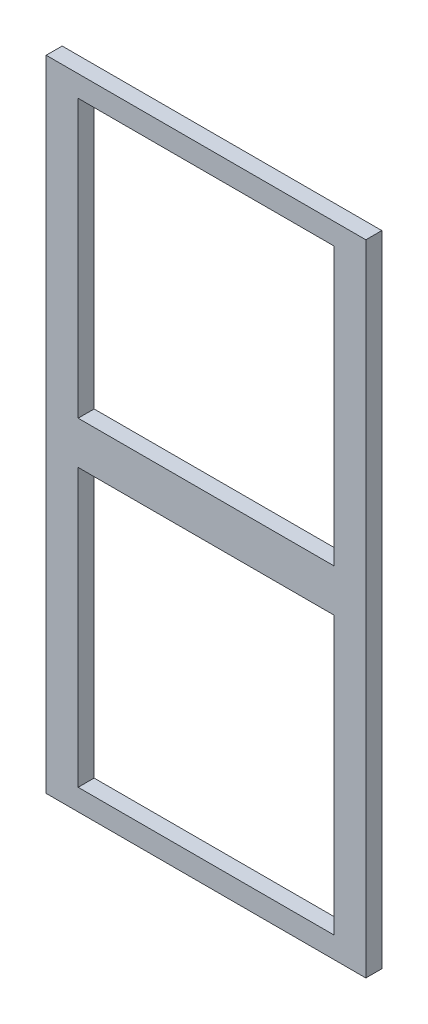
ISO-10303-21;
HEADER;
FILE_DESCRIPTION(('STEP AP214'),'2;1');
FILE_NAME('part.step','',(''),(''),'','','');
FILE_SCHEMA(('AUTOMOTIVE_DESIGN { 1 0 10303 214 1 1 1 1 }'));
ENDSEC;
DATA;
#1=APPLICATION_CONTEXT('core data for automotive mechanical design processes');
#2=APPLICATION_PROTOCOL_DEFINITION('international standard','automotive_design',2000,#1);
#3=PRODUCT_CONTEXT('',#1,'mechanical');
#4=PRODUCT('Part','Part','',(#3));
#5=PRODUCT_RELATED_PRODUCT_CATEGORY('part','',(#4));
#6=PRODUCT_DEFINITION_FORMATION('','',#4);
#7=PRODUCT_DEFINITION_CONTEXT('part definition',#1,'design');
#8=PRODUCT_DEFINITION('design','',#6,#7);
#9=PRODUCT_DEFINITION_SHAPE('','',#8);
#10=(LENGTH_UNIT() NAMED_UNIT(*) SI_UNIT(.MILLI.,.METRE.));
#11=(NAMED_UNIT(*) PLANE_ANGLE_UNIT() SI_UNIT($,.RADIAN.));
#12=(NAMED_UNIT(*) SI_UNIT($,.STERADIAN.) SOLID_ANGLE_UNIT());
#13=UNCERTAINTY_MEASURE_WITH_UNIT(LENGTH_MEASURE(1.E-05),#10,'distance_accuracy_value','');
#14=(GEOMETRIC_REPRESENTATION_CONTEXT(3) GLOBAL_UNCERTAINTY_ASSIGNED_CONTEXT((#13)) GLOBAL_UNIT_ASSIGNED_CONTEXT((#10,
#11,#12)) REPRESENTATION_CONTEXT('',''));
#15=CARTESIAN_POINT('',(0.,0.,0.));
#16=DIRECTION('',(0.,0.,1.));
#17=DIRECTION('',(1.,0.,0.));
#18=AXIS2_PLACEMENT_3D('',#15,#16,#17);
#19=CARTESIAN_POINT('',(7.5,15.,0.75));
#20=DIRECTION('',(-1.,0.,0.));
#21=DIRECTION('',(0.,-1.,0.));
#22=AXIS2_PLACEMENT_3D('',#19,#20,#21);
#23=PLANE('',#22);
#24=DIRECTION('',(0.,1.,0.));
#25=VECTOR('',#24,1.);
#26=CARTESIAN_POINT('',(7.5,15.,0.));
#27=LINE('',#26,#25);
#28=CARTESIAN_POINT('',(7.5,-15.,0.));
#29=VERTEX_POINT('',#28);
#30=CARTESIAN_POINT('',(7.5,15.,0.));
#31=VERTEX_POINT('',#30);
#32=EDGE_CURVE('E185',#29,#31,#27,.T.);
#33=ORIENTED_EDGE('',*,*,#32,.T.);
#34=DIRECTION('',(0.,0.,-1.));
#35=VECTOR('',#34,1.);
#36=CARTESIAN_POINT('',(7.5,15.,0.75));
#37=LINE('',#36,#35);
#38=CARTESIAN_POINT('',(7.5,15.,0.75));
#39=VERTEX_POINT('',#38);
#40=EDGE_CURVE('E11',#39,#31,#37,.T.);
#41=ORIENTED_EDGE('',*,*,#40,.F.);
#42=DIRECTION('',(0.,1.,0.));
#43=VECTOR('',#42,1.);
#44=CARTESIAN_POINT('',(7.5,15.,0.75));
#45=LINE('',#44,#43);
#46=CARTESIAN_POINT('',(7.5,-15.,0.75));
#47=VERTEX_POINT('',#46);
#48=EDGE_CURVE('E192',#47,#39,#45,.T.);
#49=ORIENTED_EDGE('',*,*,#48,.F.);
#50=DIRECTION('',(0.,0.,-1.));
#51=VECTOR('',#50,1.);
#52=CARTESIAN_POINT('',(7.5,-15.,0.75));
#53=LINE('',#52,#51);
#54=EDGE_CURVE('E202',#47,#29,#53,.T.);
#55=ORIENTED_EDGE('',*,*,#54,.T.);
#56=EDGE_LOOP('',(#33,#41,#49,#55));
#57=FACE_BOUND('',#56,.T.);
#58=ADVANCED_FACE('F35',(#57),#23,.F.);
#59=CARTESIAN_POINT('',(-7.5,15.,0.75));
#60=DIRECTION('',(0.,-1.,0.));
#61=DIRECTION('',(0.,0.,-1.));
#62=AXIS2_PLACEMENT_3D('',#59,#60,#61);
#63=PLANE('',#62);
#64=DIRECTION('',(-1.,0.,0.));
#65=VECTOR('',#64,1.);
#66=CARTESIAN_POINT('',(-7.5,15.,0.));
#67=LINE('',#66,#65);
#68=CARTESIAN_POINT('',(-7.5,15.,0.));
#69=VERTEX_POINT('',#68);
#70=EDGE_CURVE('E205',#31,#69,#67,.T.);
#71=ORIENTED_EDGE('',*,*,#70,.T.);
#72=DIRECTION('',(0.,0.,-1.));
#73=VECTOR('',#72,1.);
#74=CARTESIAN_POINT('',(-7.5,15.,0.75));
#75=LINE('',#74,#73);
#76=CARTESIAN_POINT('',(-7.5,15.,0.75));
#77=VERTEX_POINT('',#76);
#78=EDGE_CURVE('E42',#77,#69,#75,.T.);
#79=ORIENTED_EDGE('',*,*,#78,.F.);
#80=DIRECTION('',(-1.,0.,0.));
#81=VECTOR('',#80,1.);
#82=CARTESIAN_POINT('',(-7.5,15.,0.75));
#83=LINE('',#82,#81);
#84=EDGE_CURVE('E195',#39,#77,#83,.T.);
#85=ORIENTED_EDGE('',*,*,#84,.F.);
#86=ORIENTED_EDGE('',*,*,#40,.T.);
#87=EDGE_LOOP('',(#71,#79,#85,#86));
#88=FACE_BOUND('',#87,.T.);
#89=ADVANCED_FACE('F234',(#88),#63,.F.);
#90=CARTESIAN_POINT('',(-7.5,15.,0.75));
#91=DIRECTION('',(1.,0.,0.));
#92=DIRECTION('',(0.,1.,0.));
#93=AXIS2_PLACEMENT_3D('',#90,#91,#92);
#94=PLANE('',#93);
#95=DIRECTION('',(0.,-1.,0.));
#96=VECTOR('',#95,1.);
#97=CARTESIAN_POINT('',(-7.5,15.,0.));
#98=LINE('',#97,#96);
#99=CARTESIAN_POINT('',(-7.5,-15.,0.));
#100=VERTEX_POINT('',#99);
#101=EDGE_CURVE('E207',#69,#100,#98,.T.);
#102=ORIENTED_EDGE('',*,*,#101,.T.);
#103=DIRECTION('',(0.,0.,-1.));
#104=VECTOR('',#103,1.);
#105=CARTESIAN_POINT('',(-7.5,-15.,0.75));
#106=LINE('',#105,#104);
#107=CARTESIAN_POINT('',(-7.5,-15.,0.75));
#108=VERTEX_POINT('',#107);
#109=EDGE_CURVE('E212',#108,#100,#106,.T.);
#110=ORIENTED_EDGE('',*,*,#109,.F.);
#111=DIRECTION('',(0.,-1.,0.));
#112=VECTOR('',#111,1.);
#113=CARTESIAN_POINT('',(-7.5,15.,0.75));
#114=LINE('',#113,#112);
#115=EDGE_CURVE('E198',#77,#108,#114,.T.);
#116=ORIENTED_EDGE('',*,*,#115,.F.);
#117=ORIENTED_EDGE('',*,*,#78,.T.);
#118=EDGE_LOOP('',(#102,#110,#116,#117));
#119=FACE_BOUND('',#118,.T.);
#120=ADVANCED_FACE('F219',(#119),#94,.F.);
#121=CARTESIAN_POINT('',(-7.5,-15.,0.75));
#122=DIRECTION('',(0.,1.,0.));
#123=DIRECTION('',(0.,0.,1.));
#124=AXIS2_PLACEMENT_3D('',#121,#122,#123);
#125=PLANE('',#124);
#126=DIRECTION('',(1.,0.,0.));
#127=VECTOR('',#126,1.);
#128=CARTESIAN_POINT('',(-7.5,-15.,0.));
#129=LINE('',#128,#127);
#130=EDGE_CURVE('E196',#100,#29,#129,.T.);
#131=ORIENTED_EDGE('',*,*,#130,.T.);
#132=ORIENTED_EDGE('',*,*,#54,.F.);
#133=DIRECTION('',(1.,0.,0.));
#134=VECTOR('',#133,1.);
#135=CARTESIAN_POINT('',(-7.5,-15.,0.75));
#136=LINE('',#135,#134);
#137=EDGE_CURVE('E200',#108,#47,#136,.T.);
#138=ORIENTED_EDGE('',*,*,#137,.F.);
#139=ORIENTED_EDGE('',*,*,#109,.T.);
#140=EDGE_LOOP('',(#131,#132,#138,#139));
#141=FACE_BOUND('',#140,.T.);
#142=ADVANCED_FACE('F227',(#141),#125,.F.);
#143=CARTESIAN_POINT('',(0.,0.,0.75));
#144=DIRECTION('',(0.,0.,1.));
#145=DIRECTION('',(1.,0.,0.));
#146=AXIS2_PLACEMENT_3D('',#143,#144,#145);
#147=PLANE('',#146);
#148=DIRECTION('',(0.,-1.,0.));
#149=VECTOR('',#148,1.);
#150=CARTESIAN_POINT('',(-6.,0.999999999999998,0.75));
#151=LINE('',#150,#149);
#152=CARTESIAN_POINT('',(-6.,14.,0.75));
#153=VERTEX_POINT('',#152);
#154=CARTESIAN_POINT('',(-6.,0.999999999999998,0.75));
#155=VERTEX_POINT('',#154);
#156=EDGE_CURVE('E49',#153,#155,#151,.T.);
#157=ORIENTED_EDGE('',*,*,#156,.F.);
#158=DIRECTION('',(-1.,0.,0.));
#159=VECTOR('',#158,1.);
#160=CARTESIAN_POINT('',(-6.,14.,0.75));
#161=LINE('',#160,#159);
#162=CARTESIAN_POINT('',(6.,14.,0.75));
#163=VERTEX_POINT('',#162);
#164=EDGE_CURVE('E141',#163,#153,#161,.T.);
#165=ORIENTED_EDGE('',*,*,#164,.F.);
#166=DIRECTION('',(0.,1.,0.));
#167=VECTOR('',#166,1.);
#168=CARTESIAN_POINT('',(6.,0.999999999999998,0.75));
#169=LINE('',#168,#167);
#170=CARTESIAN_POINT('',(6.,0.999999999999998,0.75));
#171=VERTEX_POINT('',#170);
#172=EDGE_CURVE('E144',#171,#163,#169,.T.);
#173=ORIENTED_EDGE('',*,*,#172,.F.);
#174=DIRECTION('',(1.,0.,0.));
#175=VECTOR('',#174,1.);
#176=CARTESIAN_POINT('',(-6.,0.999999999999998,0.75));
#177=LINE('',#176,#175);
#178=EDGE_CURVE('E150',#155,#171,#177,.T.);
#179=ORIENTED_EDGE('',*,*,#178,.F.);
#180=EDGE_LOOP('',(#157,#165,#173,#179));
#181=FACE_BOUND('',#180,.T.);
#182=DIRECTION('',(0.,1.,0.));
#183=VECTOR('',#182,1.);
#184=CARTESIAN_POINT('',(6.,-0.999999999999998,0.75));
#185=LINE('',#184,#183);
#186=CARTESIAN_POINT('',(6.,-14.,0.75));
#187=VERTEX_POINT('',#186);
#188=CARTESIAN_POINT('',(6.,-0.999999999999998,0.75));
#189=VERTEX_POINT('',#188);
#190=EDGE_CURVE('E156',#187,#189,#185,.T.);
#191=ORIENTED_EDGE('',*,*,#190,.F.);
#192=DIRECTION('',(1.,0.,0.));
#193=VECTOR('',#192,1.);
#194=CARTESIAN_POINT('',(-6.,-14.,0.75));
#195=LINE('',#194,#193);
#196=CARTESIAN_POINT('',(-6.,-14.,0.75));
#197=VERTEX_POINT('',#196);
#198=EDGE_CURVE('E164',#197,#187,#195,.T.);
#199=ORIENTED_EDGE('',*,*,#198,.F.);
#200=DIRECTION('',(0.,-1.,0.));
#201=VECTOR('',#200,1.);
#202=CARTESIAN_POINT('',(-6.,-0.999999999999998,0.75));
#203=LINE('',#202,#201);
#204=CARTESIAN_POINT('',(-6.,-0.999999999999998,0.75));
#205=VERTEX_POINT('',#204);
#206=EDGE_CURVE('E178',#205,#197,#203,.T.);
#207=ORIENTED_EDGE('',*,*,#206,.F.);
#208=DIRECTION('',(-1.,0.,0.));
#209=VECTOR('',#208,1.);
#210=CARTESIAN_POINT('',(-6.,-0.999999999999998,0.75));
#211=LINE('',#210,#209);
#212=EDGE_CURVE('E175',#189,#205,#211,.T.);
#213=ORIENTED_EDGE('',*,*,#212,.F.);
#214=EDGE_LOOP('',(#191,#199,#207,#213));
#215=FACE_BOUND('',#214,.T.);
#216=ORIENTED_EDGE('',*,*,#48,.T.);
#217=ORIENTED_EDGE('',*,*,#84,.T.);
#218=ORIENTED_EDGE('',*,*,#115,.T.);
#219=ORIENTED_EDGE('',*,*,#137,.T.);
#220=EDGE_LOOP('',(#216,#217,#218,#219));
#221=FACE_BOUND('',#220,.T.);
#222=ADVANCED_FACE('F233',(#181,#215,#221),#147,.T.);
#223=CARTESIAN_POINT('',(0.,0.,0.));
#224=DIRECTION('',(0.,0.,1.));
#225=DIRECTION('',(1.,0.,0.));
#226=AXIS2_PLACEMENT_3D('',#223,#224,#225);
#227=PLANE('',#226);
#228=DIRECTION('',(-1.,0.,0.));
#229=VECTOR('',#228,1.);
#230=CARTESIAN_POINT('',(-6.,14.,0.));
#231=LINE('',#230,#229);
#232=CARTESIAN_POINT('',(6.,14.,0.));
#233=VERTEX_POINT('',#232);
#234=CARTESIAN_POINT('',(-6.,14.,0.));
#235=VERTEX_POINT('',#234);
#236=EDGE_CURVE('E131',#233,#235,#231,.T.);
#237=ORIENTED_EDGE('',*,*,#236,.T.);
#238=DIRECTION('',(0.,-1.,0.));
#239=VECTOR('',#238,1.);
#240=CARTESIAN_POINT('',(-6.,0.999999999999998,0.));
#241=LINE('',#240,#239);
#242=CARTESIAN_POINT('',(-6.,0.999999999999998,0.));
#243=VERTEX_POINT('',#242);
#244=EDGE_CURVE('E125',#235,#243,#241,.T.);
#245=ORIENTED_EDGE('',*,*,#244,.T.);
#246=DIRECTION('',(1.,0.,0.));
#247=VECTOR('',#246,1.);
#248=CARTESIAN_POINT('',(-6.,0.999999999999998,0.));
#249=LINE('',#248,#247);
#250=CARTESIAN_POINT('',(6.,0.999999999999998,0.));
#251=VERTEX_POINT('',#250);
#252=EDGE_CURVE('E134',#243,#251,#249,.T.);
#253=ORIENTED_EDGE('',*,*,#252,.T.);
#254=DIRECTION('',(0.,1.,0.));
#255=VECTOR('',#254,1.);
#256=CARTESIAN_POINT('',(6.,0.999999999999998,0.));
#257=LINE('',#256,#255);
#258=EDGE_CURVE('E57',#251,#233,#257,.T.);
#259=ORIENTED_EDGE('',*,*,#258,.T.);
#260=EDGE_LOOP('',(#237,#245,#253,#259));
#261=FACE_BOUND('',#260,.T.);
#262=DIRECTION('',(1.,0.,0.));
#263=VECTOR('',#262,1.);
#264=CARTESIAN_POINT('',(-6.,-14.,0.));
#265=LINE('',#264,#263);
#266=CARTESIAN_POINT('',(-6.,-14.,0.));
#267=VERTEX_POINT('',#266);
#268=CARTESIAN_POINT('',(6.,-14.,0.));
#269=VERTEX_POINT('',#268);
#270=EDGE_CURVE('E170',#267,#269,#265,.T.);
#271=ORIENTED_EDGE('',*,*,#270,.T.);
#272=DIRECTION('',(0.,1.,0.));
#273=VECTOR('',#272,1.);
#274=CARTESIAN_POINT('',(6.,-0.999999999999998,0.));
#275=LINE('',#274,#273);
#276=CARTESIAN_POINT('',(6.,-0.999999999999998,0.));
#277=VERTEX_POINT('',#276);
#278=EDGE_CURVE('E160',#269,#277,#275,.T.);
#279=ORIENTED_EDGE('',*,*,#278,.T.);
#280=DIRECTION('',(-1.,0.,0.));
#281=VECTOR('',#280,1.);
#282=CARTESIAN_POINT('',(-6.,-0.999999999999998,0.));
#283=LINE('',#282,#281);
#284=CARTESIAN_POINT('',(-6.,-0.999999999999998,0.));
#285=VERTEX_POINT('',#284);
#286=EDGE_CURVE('E163',#277,#285,#283,.T.);
#287=ORIENTED_EDGE('',*,*,#286,.T.);
#288=DIRECTION('',(0.,-1.,0.));
#289=VECTOR('',#288,1.);
#290=CARTESIAN_POINT('',(-6.,-0.999999999999998,0.));
#291=LINE('',#290,#289);
#292=EDGE_CURVE('E167',#285,#267,#291,.T.);
#293=ORIENTED_EDGE('',*,*,#292,.T.);
#294=EDGE_LOOP('',(#271,#279,#287,#293));
#295=FACE_BOUND('',#294,.T.);
#296=ORIENTED_EDGE('',*,*,#32,.F.);
#297=ORIENTED_EDGE('',*,*,#130,.F.);
#298=ORIENTED_EDGE('',*,*,#101,.F.);
#299=ORIENTED_EDGE('',*,*,#70,.F.);
#300=EDGE_LOOP('',(#296,#297,#298,#299));
#301=FACE_BOUND('',#300,.T.);
#302=ADVANCED_FACE('F138',(#261,#295,#301),#227,.F.);
#303=CARTESIAN_POINT('',(6.,-0.999999999999998,0.));
#304=DIRECTION('',(1.,0.,0.));
#305=DIRECTION('',(0.,1.,0.));
#306=AXIS2_PLACEMENT_3D('',#303,#304,#305);
#307=PLANE('',#306);
#308=ORIENTED_EDGE('',*,*,#190,.T.);
#309=DIRECTION('',(0.,0.,1.));
#310=VECTOR('',#309,1.);
#311=CARTESIAN_POINT('',(6.,-0.999999999999998,0.));
#312=LINE('',#311,#310);
#313=EDGE_CURVE('E173',#277,#189,#312,.T.);
#314=ORIENTED_EDGE('',*,*,#313,.F.);
#315=ORIENTED_EDGE('',*,*,#278,.F.);
#316=DIRECTION('',(0.,0.,1.));
#317=VECTOR('',#316,1.);
#318=CARTESIAN_POINT('',(6.,-14.,0.));
#319=LINE('',#318,#317);
#320=EDGE_CURVE('E183',#269,#187,#319,.T.);
#321=ORIENTED_EDGE('',*,*,#320,.T.);
#322=EDGE_LOOP('',(#308,#314,#315,#321));
#323=FACE_BOUND('',#322,.T.);
#324=ADVANCED_FACE('F246',(#323),#307,.F.);
#325=CARTESIAN_POINT('',(-6.,-14.,0.));
#326=DIRECTION('',(0.,-1.,0.));
#327=DIRECTION('',(0.,0.,-1.));
#328=AXIS2_PLACEMENT_3D('',#325,#326,#327);
#329=PLANE('',#328);
#330=ORIENTED_EDGE('',*,*,#198,.T.);
#331=ORIENTED_EDGE('',*,*,#320,.F.);
#332=ORIENTED_EDGE('',*,*,#270,.F.);
#333=DIRECTION('',(0.,0.,1.));
#334=VECTOR('',#333,1.);
#335=CARTESIAN_POINT('',(-6.,-14.,0.));
#336=LINE('',#335,#334);
#337=EDGE_CURVE('E186',#267,#197,#336,.T.);
#338=ORIENTED_EDGE('',*,*,#337,.T.);
#339=EDGE_LOOP('',(#330,#331,#332,#338));
#340=FACE_BOUND('',#339,.T.);
#341=ADVANCED_FACE('F252',(#340),#329,.F.);
#342=CARTESIAN_POINT('',(-6.,-0.999999999999998,0.));
#343=DIRECTION('',(-1.,0.,0.));
#344=DIRECTION('',(0.,-1.,0.));
#345=AXIS2_PLACEMENT_3D('',#342,#343,#344);
#346=PLANE('',#345);
#347=ORIENTED_EDGE('',*,*,#206,.T.);
#348=ORIENTED_EDGE('',*,*,#337,.F.);
#349=ORIENTED_EDGE('',*,*,#292,.F.);
#350=DIRECTION('',(0.,0.,1.));
#351=VECTOR('',#350,1.);
#352=CARTESIAN_POINT('',(-6.,-0.999999999999998,0.));
#353=LINE('',#352,#351);
#354=EDGE_CURVE('E188',#285,#205,#353,.T.);
#355=ORIENTED_EDGE('',*,*,#354,.T.);
#356=EDGE_LOOP('',(#347,#348,#349,#355));
#357=FACE_BOUND('',#356,.T.);
#358=ADVANCED_FACE('F257',(#357),#346,.F.);
#359=CARTESIAN_POINT('',(-6.,-0.999999999999998,0.));
#360=DIRECTION('',(0.,1.,0.));
#361=DIRECTION('',(0.,0.,1.));
#362=AXIS2_PLACEMENT_3D('',#359,#360,#361);
#363=PLANE('',#362);
#364=ORIENTED_EDGE('',*,*,#212,.T.);
#365=ORIENTED_EDGE('',*,*,#354,.F.);
#366=ORIENTED_EDGE('',*,*,#286,.F.);
#367=ORIENTED_EDGE('',*,*,#313,.T.);
#368=EDGE_LOOP('',(#364,#365,#366,#367));
#369=FACE_BOUND('',#368,.T.);
#370=ADVANCED_FACE('F254',(#369),#363,.F.);
#371=CARTESIAN_POINT('',(-6.,0.999999999999998,0.));
#372=DIRECTION('',(-1.,0.,0.));
#373=DIRECTION('',(0.,-1.,0.));
#374=AXIS2_PLACEMENT_3D('',#371,#372,#373);
#375=PLANE('',#374);
#376=ORIENTED_EDGE('',*,*,#156,.T.);
#377=DIRECTION('',(0.,0.,1.));
#378=VECTOR('',#377,1.);
#379=CARTESIAN_POINT('',(-6.,0.999999999999998,0.));
#380=LINE('',#379,#378);
#381=EDGE_CURVE('E121',#243,#155,#380,.T.);
#382=ORIENTED_EDGE('',*,*,#381,.F.);
#383=ORIENTED_EDGE('',*,*,#244,.F.);
#384=DIRECTION('',(0.,0.,1.));
#385=VECTOR('',#384,1.);
#386=CARTESIAN_POINT('',(-6.,14.,0.));
#387=LINE('',#386,#385);
#388=EDGE_CURVE('E154',#235,#153,#387,.T.);
#389=ORIENTED_EDGE('',*,*,#388,.T.);
#390=EDGE_LOOP('',(#376,#382,#383,#389));
#391=FACE_BOUND('',#390,.T.);
#392=ADVANCED_FACE('F123',(#391),#375,.F.);
#393=CARTESIAN_POINT('',(-6.,14.,0.));
#394=DIRECTION('',(0.,1.,0.));
#395=DIRECTION('',(0.,0.,1.));
#396=AXIS2_PLACEMENT_3D('',#393,#394,#395);
#397=PLANE('',#396);
#398=ORIENTED_EDGE('',*,*,#164,.T.);
#399=ORIENTED_EDGE('',*,*,#388,.F.);
#400=ORIENTED_EDGE('',*,*,#236,.F.);
#401=DIRECTION('',(0.,0.,1.));
#402=VECTOR('',#401,1.);
#403=CARTESIAN_POINT('',(6.,14.,0.));
#404=LINE('',#403,#402);
#405=EDGE_CURVE('E157',#233,#163,#404,.T.);
#406=ORIENTED_EDGE('',*,*,#405,.T.);
#407=EDGE_LOOP('',(#398,#399,#400,#406));
#408=FACE_BOUND('',#407,.T.);
#409=ADVANCED_FACE('F267',(#408),#397,.F.);
#410=CARTESIAN_POINT('',(6.,0.999999999999998,0.));
#411=DIRECTION('',(1.,0.,0.));
#412=DIRECTION('',(0.,1.,0.));
#413=AXIS2_PLACEMENT_3D('',#410,#411,#412);
#414=PLANE('',#413);
#415=ORIENTED_EDGE('',*,*,#172,.T.);
#416=ORIENTED_EDGE('',*,*,#405,.F.);
#417=ORIENTED_EDGE('',*,*,#258,.F.);
#418=DIRECTION('',(0.,0.,1.));
#419=VECTOR('',#418,1.);
#420=CARTESIAN_POINT('',(6.,0.999999999999998,0.));
#421=LINE('',#420,#419);
#422=EDGE_CURVE('E130',#251,#171,#421,.T.);
#423=ORIENTED_EDGE('',*,*,#422,.T.);
#424=EDGE_LOOP('',(#415,#416,#417,#423));
#425=FACE_BOUND('',#424,.T.);
#426=ADVANCED_FACE('F270',(#425),#414,.F.);
#427=CARTESIAN_POINT('',(-6.,0.999999999999998,0.));
#428=DIRECTION('',(0.,-1.,0.));
#429=DIRECTION('',(0.,0.,-1.));
#430=AXIS2_PLACEMENT_3D('',#427,#428,#429);
#431=PLANE('',#430);
#432=ORIENTED_EDGE('',*,*,#178,.T.);
#433=ORIENTED_EDGE('',*,*,#422,.F.);
#434=ORIENTED_EDGE('',*,*,#252,.F.);
#435=ORIENTED_EDGE('',*,*,#381,.T.);
#436=EDGE_LOOP('',(#432,#433,#434,#435));
#437=FACE_BOUND('',#436,.T.);
#438=ADVANCED_FACE('F135',(#437),#431,.F.);
#439=CLOSED_SHELL('',(#58,#89,#120,#142,#222,#302,#324,#341,#358,#370,#392,#409,#426,#438));
#440=MANIFOLD_SOLID_BREP('B2',#439);
#441=ADVANCED_BREP_SHAPE_REPRESENTATION('',(#18,#440),#14);
#442=SHAPE_DEFINITION_REPRESENTATION(#9,#441);
ENDSEC;
END-ISO-10303-21;
